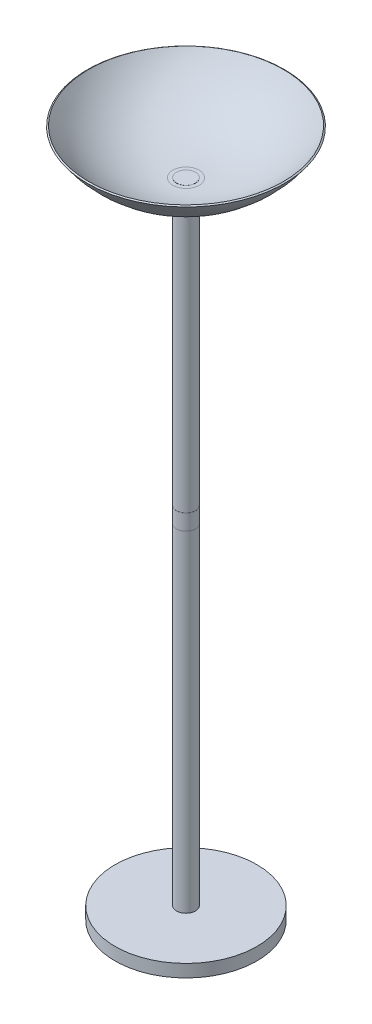
ISO-10303-21;
HEADER;
FILE_DESCRIPTION(('STEP AP214'),'2;1');
FILE_NAME('part.step','',(''),(''),'','','');
FILE_SCHEMA(('AUTOMOTIVE_DESIGN { 1 0 10303 214 1 1 1 1 }'));
ENDSEC;
DATA;
#1=APPLICATION_CONTEXT('core data for automotive mechanical design processes');
#2=APPLICATION_PROTOCOL_DEFINITION('international standard','automotive_design',2000,#1);
#3=PRODUCT_CONTEXT('',#1,'mechanical');
#4=PRODUCT('Part','Part','',(#3));
#5=PRODUCT_RELATED_PRODUCT_CATEGORY('part','',(#4));
#6=PRODUCT_DEFINITION_FORMATION('','',#4);
#7=PRODUCT_DEFINITION_CONTEXT('part definition',#1,'design');
#8=PRODUCT_DEFINITION('design','',#6,#7);
#9=PRODUCT_DEFINITION_SHAPE('','',#8);
#10=(LENGTH_UNIT() NAMED_UNIT(*) SI_UNIT(.MILLI.,.METRE.));
#11=(NAMED_UNIT(*) PLANE_ANGLE_UNIT() SI_UNIT($,.RADIAN.));
#12=(NAMED_UNIT(*) SI_UNIT($,.STERADIAN.) SOLID_ANGLE_UNIT());
#13=UNCERTAINTY_MEASURE_WITH_UNIT(LENGTH_MEASURE(1.E-05),#10,'distance_accuracy_value','');
#14=(GEOMETRIC_REPRESENTATION_CONTEXT(3) GLOBAL_UNCERTAINTY_ASSIGNED_CONTEXT((#13)) GLOBAL_UNIT_ASSIGNED_CONTEXT((#10,
#11,#12)) REPRESENTATION_CONTEXT('',''));
#15=CARTESIAN_POINT('',(0.,0.,0.));
#16=DIRECTION('',(0.,0.,1.));
#17=DIRECTION('',(1.,0.,0.));
#18=AXIS2_PLACEMENT_3D('',#15,#16,#17);
#19=CARTESIAN_POINT('',(0.,972.759098548479,0.));
#20=DIRECTION('',(0.,-1.,0.));
#21=DIRECTION('',(0.,0.,-1.));
#22=AXIS2_PLACEMENT_3D('',#19,#20,#21);
#23=CYLINDRICAL_SURFACE('',#22,24.);
#24=CARTESIAN_POINT('',(0.,252.759098548479,0.));
#25=DIRECTION('',(0.,-1.,0.));
#26=DIRECTION('',(0.,0.,-1.));
#27=AXIS2_PLACEMENT_3D('',#24,#25,#26);
#28=CIRCLE('',#27,24.);
#29=CARTESIAN_POINT('',(0.,252.759098548479,-24.));
#30=VERTEX_POINT('',#29);
#31=EDGE_CURVE('E49',#30,#30,#28,.T.);
#32=CARTESIAN_POINT('',(0.,968.592614020792,0.));
#33=DIRECTION('',(0.,1.,0.));
#34=DIRECTION('',(0.,0.,1.));
#35=AXIS2_PLACEMENT_3D('',#32,#33,#34);
#36=CIRCLE('',#35,24.);
#37=CARTESIAN_POINT('',(0.,968.592614020792,-24.));
#38=VERTEX_POINT('',#37);
#39=EDGE_CURVE('E10',#38,#38,#36,.T.);
#40=CARTESIAN_POINT('',(0.,252.759098548479,-24.));
#41=CARTESIAN_POINT('',(0.,260.215697667982,-24.));
#42=CARTESIAN_POINT('',(0.,267.672296787485,-24.));
#43=CARTESIAN_POINT('',(0.,282.585495026492,-24.));
#44=CARTESIAN_POINT('',(0.,290.042094145995,-24.));
#45=CARTESIAN_POINT('',(0.,304.955292385002,-24.));
#46=CARTESIAN_POINT('',(0.,312.411891504505,-24.));
#47=CARTESIAN_POINT('',(0.,327.325089743511,-24.));
#48=CARTESIAN_POINT('',(0.,334.781688863015,-24.));
#49=CARTESIAN_POINT('',(0.,349.694887102021,-24.));
#50=CARTESIAN_POINT('',(0.,357.151486221524,-24.));
#51=CARTESIAN_POINT('',(0.,372.064684460531,-24.));
#52=CARTESIAN_POINT('',(0.,379.521283580034,-24.));
#53=CARTESIAN_POINT('',(0.,394.434481819041,-24.));
#54=CARTESIAN_POINT('',(0.,401.891080938544,-24.));
#55=CARTESIAN_POINT('',(0.,416.804279177551,-24.));
#56=CARTESIAN_POINT('',(0.,424.260878297054,-24.));
#57=CARTESIAN_POINT('',(0.,439.17407653606,-24.));
#58=CARTESIAN_POINT('',(0.,446.630675655564,-24.));
#59=CARTESIAN_POINT('',(0.,461.54387389457,-24.));
#60=CARTESIAN_POINT('',(0.,469.000473014073,-24.));
#61=CARTESIAN_POINT('',(0.,483.91367125308,-24.));
#62=CARTESIAN_POINT('',(0.,491.370270372583,-24.));
#63=CARTESIAN_POINT('',(0.,506.28346861159,-24.));
#64=CARTESIAN_POINT('',(0.,513.740067731093,-24.));
#65=CARTESIAN_POINT('',(0.,528.653265970099,-24.));
#66=CARTESIAN_POINT('',(0.,536.109865089603,-24.));
#67=CARTESIAN_POINT('',(0.,551.023063328609,-24.));
#68=CARTESIAN_POINT('',(0.,558.479662448113,-24.));
#69=CARTESIAN_POINT('',(0.,573.392860687119,-24.));
#70=CARTESIAN_POINT('',(0.,580.849459806622,-24.));
#71=CARTESIAN_POINT('',(0.,595.762658045629,-24.));
#72=CARTESIAN_POINT('',(0.,603.219257165132,-24.));
#73=CARTESIAN_POINT('',(0.,618.132455404139,-24.));
#74=CARTESIAN_POINT('',(0.,625.589054523642,-24.));
#75=CARTESIAN_POINT('',(0.,640.502252762648,-24.));
#76=CARTESIAN_POINT('',(0.,647.958851882152,-24.));
#77=CARTESIAN_POINT('',(0.,662.872050121158,-24.));
#78=CARTESIAN_POINT('',(0.,670.328649240661,-24.));
#79=CARTESIAN_POINT('',(0.,685.241847479668,-24.));
#80=CARTESIAN_POINT('',(0.,692.698446599171,-24.));
#81=CARTESIAN_POINT('',(0.,707.611644838178,-24.));
#82=CARTESIAN_POINT('',(0.,715.068243957681,-24.));
#83=CARTESIAN_POINT('',(0.,729.981442196687,-24.));
#84=CARTESIAN_POINT('',(0.,737.438041316191,-24.));
#85=CARTESIAN_POINT('',(0.,752.351239555197,-24.));
#86=CARTESIAN_POINT('',(0.,759.807838674701,-24.));
#87=CARTESIAN_POINT('',(0.,774.721036913707,-24.));
#88=CARTESIAN_POINT('',(0.,782.17763603321,-24.));
#89=CARTESIAN_POINT('',(0.,797.090834272217,-24.));
#90=CARTESIAN_POINT('',(0.,804.54743339172,-24.));
#91=CARTESIAN_POINT('',(0.,819.460631630727,-24.));
#92=CARTESIAN_POINT('',(0.,826.91723075023,-24.));
#93=CARTESIAN_POINT('',(0.,841.830428989236,-24.));
#94=CARTESIAN_POINT('',(0.,849.28702810874,-24.));
#95=CARTESIAN_POINT('',(0.,864.200226347746,-24.));
#96=CARTESIAN_POINT('',(0.,871.65682546725,-24.));
#97=CARTESIAN_POINT('',(0.,886.570023706256,-24.));
#98=CARTESIAN_POINT('',(0.,894.026622825759,-24.));
#99=CARTESIAN_POINT('',(0.,908.939821064766,-24.));
#100=CARTESIAN_POINT('',(0.,916.396420184269,-24.));
#101=CARTESIAN_POINT('',(0.,931.309618423276,-24.));
#102=CARTESIAN_POINT('',(0.,938.766217542779,-24.));
#103=CARTESIAN_POINT('',(0.,953.679415781785,-24.));
#104=CARTESIAN_POINT('',(0.,961.136014901289,-24.));
#105=CARTESIAN_POINT('',(0.,968.592614020792,-24.));
#106=B_SPLINE_CURVE_WITH_KNOTS('',3,(#40,#41,#42,#43,#44,#45,#46,#47,#48,#49,#50,#51,#52,#53,
#54,#55,#56,#57,#58,#59,#60,#61,#62,#63,#64,#65,#66,#67,#68,#69,#70,#71,#72,#73,#74,#75,#76,#77,
#78,#79,#80,#81,#82,#83,#84,#85,#86,#87,#88,#89,#90,#91,#92,#93,#94,#95,#96,#97,#98,#99,#100,
#101,#102,#103,#104,#105),.UNSPECIFIED.,.F.,.F.,(4,2,2,2,2,2,2,2,2,2,2,2,2,2,2,2,2,2,2,2,2,2,2,
2,2,2,2,2,2,2,2,2,4),(0.,22.3697973585097,44.7395947170196,67.1093920755294,89.4791894340392,
111.848986792549,134.218784151059,156.588581509569,178.958378868078,201.328176226588,
223.697973585098,246.067770943608,268.437568302117,290.807365660627,313.177163019137,
335.546960377647,357.916757736157,380.286555094666,402.656352453176,425.026149811686,
447.395947170196,469.765744528706,492.135541887215,514.505339245725,536.875136604235,
559.244933962745,581.614731321255,603.984528679764,626.354326038274,648.724123396784,
671.093920755294,693.463718113804,715.833515472313),.UNSPECIFIED.);
#107=EDGE_CURVE('BSEAM37',#30,#38,#106,.T.);
#108=ORIENTED_EDGE('',*,*,#31,.F.);
#109=ORIENTED_EDGE('',*,*,#39,.F.);
#110=ORIENTED_EDGE('',*,*,#107,.T.);
#111=ORIENTED_EDGE('',*,*,#107,.F.);
#112=EDGE_LOOP('',(#108,#110,#109,#111));
#113=FACE_BOUND('',#112,.T.);
#114=ADVANCED_FACE('F37',(#113),#23,.T.);
#115=CARTESIAN_POINT('',(0.,212.759098548479,0.));
#116=DIRECTION('',(0.,1.,0.));
#117=DIRECTION('',(0.,0.,1.));
#118=AXIS2_PLACEMENT_3D('',#115,#116,#117);
#119=CYLINDRICAL_SURFACE('',#118,24.2);
#120=CARTESIAN_POINT('',(0.,212.759098548479,0.));
#121=DIRECTION('',(0.,-1.,0.));
#122=DIRECTION('',(0.,0.,-1.));
#123=AXIS2_PLACEMENT_3D('',#120,#121,#122);
#124=CIRCLE('',#123,24.2);
#125=CARTESIAN_POINT('',(0.,212.759098548479,-24.2));
#126=VERTEX_POINT('',#125);
#127=EDGE_CURVE('E54',#126,#126,#124,.T.);
#128=ORIENTED_EDGE('',*,*,#127,.F.);
#129=EDGE_LOOP('',(#128));
#130=FACE_BOUND('',#129,.T.);
#131=CARTESIAN_POINT('',(0.,252.759098548479,0.));
#132=DIRECTION('',(0.,-1.,0.));
#133=DIRECTION('',(0.,0.,-1.));
#134=AXIS2_PLACEMENT_3D('',#131,#132,#133);
#135=CIRCLE('',#134,24.2);
#136=CARTESIAN_POINT('',(0.,252.759098548479,-24.2));
#137=VERTEX_POINT('',#136);
#138=EDGE_CURVE('E55',#137,#137,#135,.T.);
#139=ORIENTED_EDGE('',*,*,#138,.T.);
#140=EDGE_LOOP('',(#139));
#141=FACE_BOUND('',#140,.T.);
#142=ADVANCED_FACE('F101',(#130,#141),#119,.T.);
#143=CARTESIAN_POINT('',(0.,212.759098548479,0.));
#144=DIRECTION('',(0.,-1.,0.));
#145=DIRECTION('',(0.,0.,-1.));
#146=AXIS2_PLACEMENT_3D('',#143,#144,#145);
#147=PLANE('',#146);
#148=CARTESIAN_POINT('',(0.,212.759098548479,0.));
#149=DIRECTION('',(0.,-1.,0.));
#150=DIRECTION('',(0.,0.,-1.));
#151=AXIS2_PLACEMENT_3D('',#148,#149,#150);
#152=CIRCLE('',#151,24.);
#153=CARTESIAN_POINT('',(0.,212.759098548479,-24.));
#154=VERTEX_POINT('',#153);
#155=EDGE_CURVE('E61',#154,#154,#152,.T.);
#156=ORIENTED_EDGE('',*,*,#155,.F.);
#157=EDGE_LOOP('',(#156));
#158=FACE_BOUND('',#157,.T.);
#159=ORIENTED_EDGE('',*,*,#127,.T.);
#160=EDGE_LOOP('',(#159));
#161=FACE_BOUND('',#160,.T.);
#162=ADVANCED_FACE('F106',(#158,#161),#147,.T.);
#163=CARTESIAN_POINT('',(0.,252.759098548479,0.));
#164=DIRECTION('',(0.,-1.,0.));
#165=DIRECTION('',(0.,0.,-1.));
#166=AXIS2_PLACEMENT_3D('',#163,#164,#165);
#167=PLANE('',#166);
#168=ORIENTED_EDGE('',*,*,#31,.T.);
#169=EDGE_LOOP('',(#168));
#170=FACE_BOUND('',#169,.T.);
#171=ORIENTED_EDGE('',*,*,#138,.F.);
#172=EDGE_LOOP('',(#171));
#173=FACE_BOUND('',#172,.T.);
#174=ADVANCED_FACE('F150',(#170,#173),#167,.F.);
#175=CARTESIAN_POINT('',(0.,-627.240901451521,0.));
#176=DIRECTION('',(0.,1.,0.));
#177=DIRECTION('',(0.,0.,1.));
#178=AXIS2_PLACEMENT_3D('',#175,#176,#177);
#179=CYLINDRICAL_SURFACE('',#178,24.);
#180=CARTESIAN_POINT('',(0.,-627.240901451521,0.));
#181=DIRECTION('',(0.,-1.,0.));
#182=DIRECTION('',(0.,0.,-1.));
#183=AXIS2_PLACEMENT_3D('',#180,#181,#182);
#184=CIRCLE('',#183,24.);
#185=CARTESIAN_POINT('',(0.,-627.240901451521,-24.));
#186=VERTEX_POINT('',#185);
#187=EDGE_CURVE('E58',#186,#186,#184,.T.);
#188=ORIENTED_EDGE('',*,*,#187,.F.);
#189=EDGE_LOOP('',(#188));
#190=FACE_BOUND('',#189,.T.);
#191=ORIENTED_EDGE('',*,*,#155,.T.);
#192=EDGE_LOOP('',(#191));
#193=FACE_BOUND('',#192,.T.);
#194=ADVANCED_FACE('F146',(#190,#193),#179,.T.);
#195=CARTESIAN_POINT('',(0.,-659.240901451521,0.));
#196=DIRECTION('',(0.,1.,0.));
#197=DIRECTION('',(0.,0.,1.));
#198=AXIS2_PLACEMENT_3D('',#195,#196,#197);
#199=CYLINDRICAL_SURFACE('',#198,180.);
#200=CARTESIAN_POINT('',(0.,-659.240901451521,0.));
#201=DIRECTION('',(0.,-1.,0.));
#202=DIRECTION('',(0.,0.,-1.));
#203=AXIS2_PLACEMENT_3D('',#200,#201,#202);
#204=CIRCLE('',#203,180.);
#205=CARTESIAN_POINT('',(0.,-659.240901451521,-180.));
#206=VERTEX_POINT('',#205);
#207=EDGE_CURVE('E64',#206,#206,#204,.T.);
#208=ORIENTED_EDGE('',*,*,#207,.F.);
#209=EDGE_LOOP('',(#208));
#210=FACE_BOUND('',#209,.T.);
#211=CARTESIAN_POINT('',(0.,-627.240901451521,0.));
#212=DIRECTION('',(0.,-1.,0.));
#213=DIRECTION('',(0.,0.,-1.));
#214=AXIS2_PLACEMENT_3D('',#211,#212,#213);
#215=CIRCLE('',#214,180.);
#216=CARTESIAN_POINT('',(0.,-627.240901451521,-180.));
#217=VERTEX_POINT('',#216);
#218=EDGE_CURVE('E67',#217,#217,#215,.T.);
#219=ORIENTED_EDGE('',*,*,#218,.T.);
#220=EDGE_LOOP('',(#219));
#221=FACE_BOUND('',#220,.T.);
#222=ADVANCED_FACE('F139',(#210,#221),#199,.T.);
#223=CARTESIAN_POINT('',(0.,-659.240901451521,0.));
#224=DIRECTION('',(0.,-1.,0.));
#225=DIRECTION('',(0.,0.,-1.));
#226=AXIS2_PLACEMENT_3D('',#223,#224,#225);
#227=PLANE('',#226);
#228=ORIENTED_EDGE('',*,*,#207,.T.);
#229=EDGE_LOOP('',(#228));
#230=FACE_BOUND('',#229,.T.);
#231=ADVANCED_FACE('F136',(#230),#227,.T.);
#232=CARTESIAN_POINT('',(0.,-627.240901451521,0.));
#233=DIRECTION('',(0.,-1.,0.));
#234=DIRECTION('',(0.,0.,-1.));
#235=AXIS2_PLACEMENT_3D('',#232,#233,#234);
#236=PLANE('',#235);
#237=ORIENTED_EDGE('',*,*,#187,.T.);
#238=EDGE_LOOP('',(#237));
#239=FACE_BOUND('',#238,.T.);
#240=ORIENTED_EDGE('',*,*,#218,.F.);
#241=EDGE_LOOP('',(#240));
#242=FACE_BOUND('',#241,.T.);
#243=ADVANCED_FACE('F134',(#239,#242),#236,.F.);
#244=CARTESIAN_POINT('',(0.,1228.61201321609,0.));
#245=DIRECTION('',(0.,1.,0.));
#246=DIRECTION('',(0.,0.,1.));
#247=AXIS2_PLACEMENT_3D('',#244,#245,#246);
#248=DEGENERATE_TOROIDAL_SURFACE('',#247,33.3698763219436,260.0193991953,.T.);
#249=CARTESIAN_POINT('',(0.,1085.25333342164,0.));
#250=DIRECTION('',(0.,1.,0.));
#251=DIRECTION('',(0.,0.,1.));
#252=AXIS2_PLACEMENT_3D('',#249,#250,#251);
#253=CIRCLE('',#252,250.299304674754);
#254=CARTESIAN_POINT('',(0.,1085.25333342164,250.299304674754));
#255=VERTEX_POINT('',#254);
#256=EDGE_CURVE('E72',#255,#255,#253,.T.);
#257=ORIENTED_EDGE('',*,*,#256,.F.);
#258=EDGE_LOOP('',(#257));
#259=FACE_BOUND('',#258,.T.);
#260=CARTESIAN_POINT('',(0.,968.592614020792,0.));
#261=DIRECTION('',(0.,1.,0.));
#262=DIRECTION('',(0.,0.,1.));
#263=AXIS2_PLACEMENT_3D('',#260,#261,#262);
#264=CIRCLE('',#263,33.3698763219435);
#265=CARTESIAN_POINT('',(0.,968.592614020792,33.3698763219435));
#266=VERTEX_POINT('',#265);
#267=EDGE_CURVE('E81',#266,#266,#264,.T.);
#268=ORIENTED_EDGE('',*,*,#267,.T.);
#269=EDGE_LOOP('',(#268));
#270=FACE_BOUND('',#269,.T.);
#271=ADVANCED_FACE('F85',(#259,#270),#248,.T.);
#272=CARTESIAN_POINT('',(0.,1087.45868702584,0.));
#273=DIRECTION('',(0.,-1.,0.));
#274=DIRECTION('',(0.,0.,-1.));
#275=AXIS2_PLACEMENT_3D('',#272,#273,#274);
#276=CONICAL_SURFACE('',#275,246.962177844615,0.986828682198911);
#277=ORIENTED_EDGE('',*,*,#256,.T.);
#278=EDGE_LOOP('',(#277));
#279=FACE_BOUND('',#278,.T.);
#280=CARTESIAN_POINT('',(0.,1087.45868702584,0.));
#281=DIRECTION('',(0.,1.,0.));
#282=DIRECTION('',(0.,0.,1.));
#283=AXIS2_PLACEMENT_3D('',#280,#281,#282);
#284=CIRCLE('',#283,246.962177844615);
#285=CARTESIAN_POINT('',(0.,1087.45868702584,246.962177844615));
#286=VERTEX_POINT('',#285);
#287=EDGE_CURVE('E75',#286,#286,#284,.T.);
#288=ORIENTED_EDGE('',*,*,#287,.F.);
#289=EDGE_LOOP('',(#288));
#290=FACE_BOUND('',#289,.T.);
#291=ADVANCED_FACE('F123',(#279,#290),#276,.T.);
#292=CARTESIAN_POINT('',(0.,1228.61201321609,0.));
#293=DIRECTION('',(0.,1.,0.));
#294=DIRECTION('',(0.,0.,1.));
#295=AXIS2_PLACEMENT_3D('',#292,#293,#294);
#296=DEGENERATE_TOROIDAL_SURFACE('',#295,33.3698763219436,256.0193991953,.T.);
#297=ORIENTED_EDGE('',*,*,#287,.T.);
#298=EDGE_LOOP('',(#297));
#299=FACE_BOUND('',#298,.T.);
#300=CARTESIAN_POINT('',(0.,972.592614020792,0.));
#301=DIRECTION('',(0.,1.,0.));
#302=DIRECTION('',(0.,0.,1.));
#303=AXIS2_PLACEMENT_3D('',#300,#301,#302);
#304=CIRCLE('',#303,33.3698763219436);
#305=CARTESIAN_POINT('',(0.,972.592614020792,33.3698763219436));
#306=VERTEX_POINT('',#305);
#307=EDGE_CURVE('E78',#306,#306,#304,.T.);
#308=ORIENTED_EDGE('',*,*,#307,.F.);
#309=EDGE_LOOP('',(#308));
#310=FACE_BOUND('',#309,.T.);
#311=ADVANCED_FACE('F97',(#299,#310),#296,.F.);
#312=CARTESIAN_POINT('',(0.,972.592614020792,0.));
#313=DIRECTION('',(0.,1.,0.));
#314=DIRECTION('',(0.,0.,1.));
#315=AXIS2_PLACEMENT_3D('',#312,#313,#314);
#316=PLANE('',#315);
#317=CARTESIAN_POINT('',(0.,972.592614020792,0.));
#318=DIRECTION('',(0.,1.,0.));
#319=DIRECTION('',(0.,0.,1.));
#320=AXIS2_PLACEMENT_3D('',#317,#318,#319);
#321=CIRCLE('',#320,24.);
#322=CARTESIAN_POINT('',(0.,972.592614020792,-24.));
#323=VERTEX_POINT('',#322);
#324=EDGE_CURVE('E41',#323,#323,#321,.T.);
#325=ORIENTED_EDGE('',*,*,#324,.F.);
#326=EDGE_LOOP('',(#325));
#327=FACE_BOUND('',#326,.T.);
#328=ORIENTED_EDGE('',*,*,#307,.T.);
#329=EDGE_LOOP('',(#328));
#330=FACE_BOUND('',#329,.T.);
#331=ADVANCED_FACE('F90',(#327,#330),#316,.T.);
#332=CARTESIAN_POINT('',(0.,968.592614020792,0.));
#333=DIRECTION('',(0.,1.,0.));
#334=DIRECTION('',(0.,0.,1.));
#335=AXIS2_PLACEMENT_3D('',#332,#333,#334);
#336=PLANE('',#335);
#337=ORIENTED_EDGE('',*,*,#39,.T.);
#338=EDGE_LOOP('',(#337));
#339=FACE_BOUND('',#338,.T.);
#340=ORIENTED_EDGE('',*,*,#267,.F.);
#341=EDGE_LOOP('',(#340));
#342=FACE_BOUND('',#341,.T.);
#343=ADVANCED_FACE('F87',(#339,#342),#336,.F.);
#344=CARTESIAN_POINT('',(0.,972.759098548479,0.));
#345=DIRECTION('',(0.,1.,0.));
#346=DIRECTION('',(0.,0.,1.));
#347=AXIS2_PLACEMENT_3D('',#344,#345,#346);
#348=PLANE('',#347);
#349=CARTESIAN_POINT('',(0.,972.759098548479,0.));
#350=DIRECTION('',(0.,1.,0.));
#351=DIRECTION('',(0.,0.,1.));
#352=AXIS2_PLACEMENT_3D('',#349,#350,#351);
#353=CIRCLE('',#352,24.);
#354=CARTESIAN_POINT('',(0.,972.759098548479,-24.));
#355=VERTEX_POINT('',#354);
#356=EDGE_CURVE('E45',#355,#355,#353,.T.);
#357=ORIENTED_EDGE('',*,*,#356,.T.);
#358=EDGE_LOOP('',(#357));
#359=FACE_BOUND('',#358,.T.);
#360=ADVANCED_FACE('F89',(#359),#348,.T.);
#361=CARTESIAN_POINT('',(0.,972.592614020792,-24.));
#362=CARTESIAN_POINT('',(0.,972.594348234622,-24.));
#363=CARTESIAN_POINT('',(0.,972.596082448452,-24.));
#364=CARTESIAN_POINT('',(0.,972.599550876112,-24.));
#365=CARTESIAN_POINT('',(0.,972.601285089942,-24.));
#366=CARTESIAN_POINT('',(0.,972.604753517602,-24.));
#367=CARTESIAN_POINT('',(0.,972.606487731432,-24.));
#368=CARTESIAN_POINT('',(0.,972.609956159093,-24.));
#369=CARTESIAN_POINT('',(0.,972.611690372923,-24.));
#370=CARTESIAN_POINT('',(0.,972.615158800583,-24.));
#371=CARTESIAN_POINT('',(0.,972.616893014413,-24.));
#372=CARTESIAN_POINT('',(0.,972.620361442073,-24.));
#373=CARTESIAN_POINT('',(0.,972.622095655903,-24.));
#374=CARTESIAN_POINT('',(0.,972.625564083563,-24.));
#375=CARTESIAN_POINT('',(0.,972.627298297393,-24.));
#376=CARTESIAN_POINT('',(0.,972.630766725053,-24.));
#377=CARTESIAN_POINT('',(0.,972.632500938883,-24.));
#378=CARTESIAN_POINT('',(0.,972.635969366544,-24.));
#379=CARTESIAN_POINT('',(0.,972.637703580374,-24.));
#380=CARTESIAN_POINT('',(0.,972.641172008034,-24.));
#381=CARTESIAN_POINT('',(0.,972.642906221864,-24.));
#382=CARTESIAN_POINT('',(0.,972.646374649524,-24.));
#383=CARTESIAN_POINT('',(0.,972.648108863354,-24.));
#384=CARTESIAN_POINT('',(0.,972.651577291014,-24.));
#385=CARTESIAN_POINT('',(0.,972.653311504844,-24.));
#386=CARTESIAN_POINT('',(0.,972.656779932504,-24.));
#387=CARTESIAN_POINT('',(0.,972.658514146334,-24.));
#388=CARTESIAN_POINT('',(0.,972.661982573995,-24.));
#389=CARTESIAN_POINT('',(0.,972.663716787825,-24.));
#390=CARTESIAN_POINT('',(0.,972.667185215485,-24.));
#391=CARTESIAN_POINT('',(0.,972.668919429315,-24.));
#392=CARTESIAN_POINT('',(0.,972.672387856975,-24.));
#393=CARTESIAN_POINT('',(0.,972.674122070805,-24.));
#394=CARTESIAN_POINT('',(0.,972.677590498465,-24.));
#395=CARTESIAN_POINT('',(0.,972.679324712295,-24.));
#396=CARTESIAN_POINT('',(0.,972.682793139955,-24.));
#397=CARTESIAN_POINT('',(0.,972.684527353785,-24.));
#398=CARTESIAN_POINT('',(0.,972.687995781446,-24.));
#399=CARTESIAN_POINT('',(0.,972.689729995276,-24.));
#400=CARTESIAN_POINT('',(0.,972.693198422936,-24.));
#401=CARTESIAN_POINT('',(0.,972.694932636766,-24.));
#402=CARTESIAN_POINT('',(0.,972.698401064426,-24.));
#403=CARTESIAN_POINT('',(0.,972.700135278256,-24.));
#404=CARTESIAN_POINT('',(0.,972.703603705916,-24.));
#405=CARTESIAN_POINT('',(0.,972.705337919746,-24.));
#406=CARTESIAN_POINT('',(0.,972.708806347406,-24.));
#407=CARTESIAN_POINT('',(0.,972.710540561236,-24.));
#408=CARTESIAN_POINT('',(0.,972.714008988897,-24.));
#409=CARTESIAN_POINT('',(0.,972.715743202727,-24.));
#410=CARTESIAN_POINT('',(0.,972.719211630387,-24.));
#411=CARTESIAN_POINT('',(0.,972.720945844217,-24.));
#412=CARTESIAN_POINT('',(0.,972.724414271877,-24.));
#413=CARTESIAN_POINT('',(0.,972.726148485707,-24.));
#414=CARTESIAN_POINT('',(0.,972.729616913367,-24.));
#415=CARTESIAN_POINT('',(0.,972.731351127197,-24.));
#416=CARTESIAN_POINT('',(0.,972.734819554857,-24.));
#417=CARTESIAN_POINT('',(0.,972.736553768688,-24.));
#418=CARTESIAN_POINT('',(0.,972.740022196348,-24.));
#419=CARTESIAN_POINT('',(0.,972.741756410178,-24.));
#420=CARTESIAN_POINT('',(0.,972.745224837838,-24.));
#421=CARTESIAN_POINT('',(0.,972.746959051668,-24.));
#422=CARTESIAN_POINT('',(0.,972.750427479328,-24.));
#423=CARTESIAN_POINT('',(0.,972.752161693158,-24.));
#424=CARTESIAN_POINT('',(0.,972.755630120818,-24.));
#425=CARTESIAN_POINT('',(0.,972.757364334648,-24.));
#426=CARTESIAN_POINT('',(0.,972.759098548479,-24.));
#427=B_SPLINE_CURVE_WITH_KNOTS('',3,(#361,#362,#363,#364,#365,#366,#367,#368,#369,#370,#371,
#372,#373,#374,#375,#376,#377,#378,#379,#380,#381,#382,#383,#384,#385,#386,#387,#388,#389,#390,
#391,#392,#393,#394,#395,#396,#397,#398,#399,#400,#401,#402,#403,#404,#405,#406,#407,#408,#409,
#410,#411,#412,#413,#414,#415,#416,#417,#418,#419,#420,#421,#422,#423,#424,#425,#426),
.UNSPECIFIED.,.F.,.F.,(4,2,2,2,2,2,2,2,2,2,2,2,2,2,2,2,2,2,2,2,2,2,2,2,2,2,2,2,2,2,2,2,4),(0.,
0.00520264149017624,0.0104052829803525,0.0156079244705287,0.020810565960816,0.0260132074509922,
0.0312158489411685,0.0364184904313447,0.041621131921632,0.0468237734118082,0.0520264149019845,
0.0572290563921607,0.062431697882448,0.0676343393726242,0.0728369808628004,0.0780396223529767,
0.0832422638432639,0.0884449053334402,0.0936475468236164,0.0988501883137927,0.10405282980408,
0.109255471294256,0.114458112784432,0.119660754274609,0.124863395764896,0.130066037255072,
0.135268678745248,0.140471320235425,0.145673961725712,0.150876603215888,0.156079244706064,
0.161281886196241,0.166484527686528),.UNSPECIFIED.);
#428=EDGE_CURVE('BSEAM39',#323,#355,#427,.T.);
#429=ORIENTED_EDGE('',*,*,#324,.T.);
#430=ORIENTED_EDGE('',*,*,#356,.F.);
#431=ORIENTED_EDGE('',*,*,#428,.T.);
#432=ORIENTED_EDGE('',*,*,#428,.F.);
#433=EDGE_LOOP('',(#429,#431,#430,#432));
#434=FACE_BOUND('',#433,.T.);
#435=ADVANCED_FACE('F39',(#434),#23,.T.);
#436=CLOSED_SHELL('',(#114,#142,#162,#174,#194,#222,#231,#243,#271,#291,#311,#331,#343,#360,#435));
#437=MANIFOLD_SOLID_BREP('B2',#436);
#438=ADVANCED_BREP_SHAPE_REPRESENTATION('',(#18,#437),#14);
#439=SHAPE_DEFINITION_REPRESENTATION(#9,#438);
ENDSEC;
END-ISO-10303-21;
